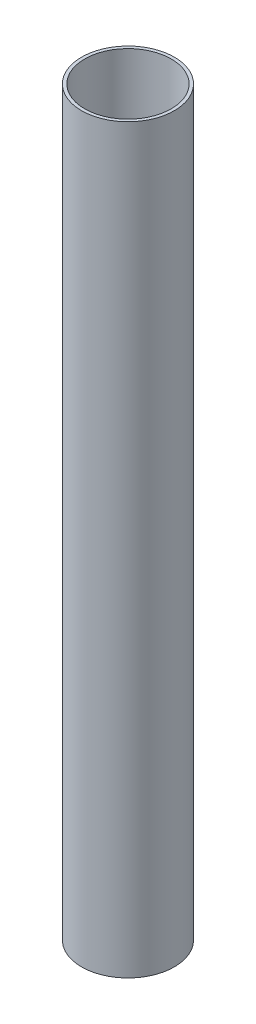
ISO-10303-21;
HEADER;
FILE_DESCRIPTION(('STEP AP214'),'2;1');
FILE_NAME('part.step','',(''),(''),'','','');
FILE_SCHEMA(('AUTOMOTIVE_DESIGN { 1 0 10303 214 1 1 1 1 }'));
ENDSEC;
DATA;
#1=APPLICATION_CONTEXT('core data for automotive mechanical design processes');
#2=APPLICATION_PROTOCOL_DEFINITION('international standard','automotive_design',2000,#1);
#3=PRODUCT_CONTEXT('',#1,'mechanical');
#4=PRODUCT('Part','Part','',(#3));
#5=PRODUCT_RELATED_PRODUCT_CATEGORY('part','',(#4));
#6=PRODUCT_DEFINITION_FORMATION('','',#4);
#7=PRODUCT_DEFINITION_CONTEXT('part definition',#1,'design');
#8=PRODUCT_DEFINITION('design','',#6,#7);
#9=PRODUCT_DEFINITION_SHAPE('','',#8);
#10=(LENGTH_UNIT() NAMED_UNIT(*) SI_UNIT(.MILLI.,.METRE.));
#11=(NAMED_UNIT(*) PLANE_ANGLE_UNIT() SI_UNIT($,.RADIAN.));
#12=(NAMED_UNIT(*) SI_UNIT($,.STERADIAN.) SOLID_ANGLE_UNIT());
#13=UNCERTAINTY_MEASURE_WITH_UNIT(LENGTH_MEASURE(1.E-05),#10,'distance_accuracy_value','');
#14=(GEOMETRIC_REPRESENTATION_CONTEXT(3) GLOBAL_UNCERTAINTY_ASSIGNED_CONTEXT((#13)) GLOBAL_UNIT_ASSIGNED_CONTEXT((#10,
#11,#12)) REPRESENTATION_CONTEXT('',''));
#15=CARTESIAN_POINT('',(0.,0.,0.));
#16=DIRECTION('',(0.,0.,1.));
#17=DIRECTION('',(1.,0.,0.));
#18=AXIS2_PLACEMENT_3D('',#15,#16,#17);
#19=CARTESIAN_POINT('',(0.,602.488,0.));
#20=DIRECTION('',(0.,1.,0.));
#21=DIRECTION('',(0.,0.,1.));
#22=AXIS2_PLACEMENT_3D('',#19,#20,#21);
#23=PLANE('',#22);
#24=CARTESIAN_POINT('',(0.,602.488,0.));
#25=DIRECTION('',(0.,1.,0.));
#26=DIRECTION('',(0.,0.,1.));
#27=AXIS2_PLACEMENT_3D('',#24,#25,#26);
#28=CIRCLE('',#27,37.7);
#29=CARTESIAN_POINT('',(0.,602.488,37.7));
#30=VERTEX_POINT('',#29);
#31=EDGE_CURVE('E10',#30,#30,#28,.T.);
#32=ORIENTED_EDGE('',*,*,#31,.T.);
#33=EDGE_LOOP('',(#32));
#34=FACE_BOUND('',#33,.T.);
#35=CARTESIAN_POINT('',(0.,602.488,0.));
#36=DIRECTION('',(0.,1.,0.));
#37=DIRECTION('',(0.,0.,1.));
#38=AXIS2_PLACEMENT_3D('',#35,#36,#37);
#39=CIRCLE('',#38,35.15);
#40=CARTESIAN_POINT('',(0.,602.488,35.15));
#41=VERTEX_POINT('',#40);
#42=EDGE_CURVE('E62',#41,#41,#39,.T.);
#43=ORIENTED_EDGE('',*,*,#42,.F.);
#44=EDGE_LOOP('',(#43));
#45=FACE_BOUND('',#44,.T.);
#46=ADVANCED_FACE('F49',(#34,#45),#23,.T.);
#47=CARTESIAN_POINT('',(0.,0.,0.));
#48=DIRECTION('',(0.,1.,0.));
#49=DIRECTION('',(0.,0.,1.));
#50=AXIS2_PLACEMENT_3D('',#47,#48,#49);
#51=PLANE('',#50);
#52=CARTESIAN_POINT('',(0.,0.,0.));
#53=DIRECTION('',(0.,1.,0.));
#54=DIRECTION('',(0.,0.,1.));
#55=AXIS2_PLACEMENT_3D('',#52,#53,#54);
#56=CIRCLE('',#55,37.7);
#57=CARTESIAN_POINT('',(0.,0.,37.7));
#58=VERTEX_POINT('',#57);
#59=EDGE_CURVE('E53',#58,#58,#56,.T.);
#60=ORIENTED_EDGE('',*,*,#59,.F.);
#61=EDGE_LOOP('',(#60));
#62=FACE_BOUND('',#61,.T.);
#63=CARTESIAN_POINT('',(0.,0.,0.));
#64=DIRECTION('',(0.,1.,0.));
#65=DIRECTION('',(0.,0.,1.));
#66=AXIS2_PLACEMENT_3D('',#63,#64,#65);
#67=CIRCLE('',#66,35.15);
#68=CARTESIAN_POINT('',(0.,0.,35.15));
#69=VERTEX_POINT('',#68);
#70=EDGE_CURVE('E64',#69,#69,#67,.T.);
#71=ORIENTED_EDGE('',*,*,#70,.T.);
#72=EDGE_LOOP('',(#71));
#73=FACE_BOUND('',#72,.T.);
#74=ADVANCED_FACE('F76',(#62,#73),#51,.F.);
#75=CARTESIAN_POINT('',(0.,602.488,0.));
#76=DIRECTION('',(0.,-1.,0.));
#77=DIRECTION('',(0.,0.,-1.));
#78=AXIS2_PLACEMENT_3D('',#75,#76,#77);
#79=CYLINDRICAL_SURFACE('',#78,37.7);
#80=ORIENTED_EDGE('',*,*,#31,.F.);
#81=EDGE_LOOP('',(#80));
#82=FACE_BOUND('',#81,.T.);
#83=ORIENTED_EDGE('',*,*,#59,.T.);
#84=EDGE_LOOP('',(#83));
#85=FACE_BOUND('',#84,.T.);
#86=ADVANCED_FACE('F51',(#82,#85),#79,.T.);
#87=CARTESIAN_POINT('',(0.,602.488,0.));
#88=DIRECTION('',(0.,-1.,0.));
#89=DIRECTION('',(0.,0.,-1.));
#90=AXIS2_PLACEMENT_3D('',#87,#88,#89);
#91=CYLINDRICAL_SURFACE('',#90,35.15);
#92=ORIENTED_EDGE('',*,*,#42,.T.);
#93=EDGE_LOOP('',(#92));
#94=FACE_BOUND('',#93,.T.);
#95=ORIENTED_EDGE('',*,*,#70,.F.);
#96=EDGE_LOOP('',(#95));
#97=FACE_BOUND('',#96,.T.);
#98=ADVANCED_FACE('F72',(#94,#97),#91,.F.);
#99=CLOSED_SHELL('',(#46,#74,#86,#98));
#100=MANIFOLD_SOLID_BREP('B2',#99);
#101=ADVANCED_BREP_SHAPE_REPRESENTATION('',(#18,#100),#14);
#102=SHAPE_DEFINITION_REPRESENTATION(#9,#101);
ENDSEC;
END-ISO-10303-21;
